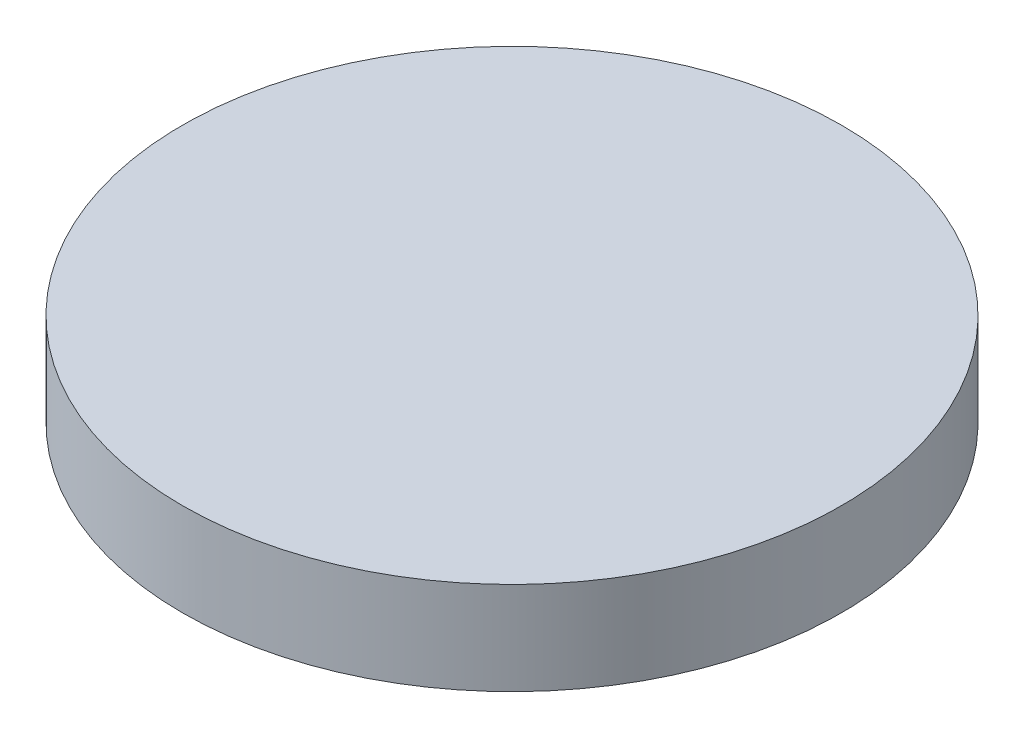
ISO-10303-21;
HEADER;
FILE_DESCRIPTION(('STEP AP214'),'2;1');
FILE_NAME('part.step','',(''),(''),'','','');
FILE_SCHEMA(('AUTOMOTIVE_DESIGN { 1 0 10303 214 1 1 1 1 }'));
ENDSEC;
DATA;
#1=APPLICATION_CONTEXT('core data for automotive mechanical design processes');
#2=APPLICATION_PROTOCOL_DEFINITION('international standard','automotive_design',2000,#1);
#3=PRODUCT_CONTEXT('',#1,'mechanical');
#4=PRODUCT('Part','Part','',(#3));
#5=PRODUCT_RELATED_PRODUCT_CATEGORY('part','',(#4));
#6=PRODUCT_DEFINITION_FORMATION('','',#4);
#7=PRODUCT_DEFINITION_CONTEXT('part definition',#1,'design');
#8=PRODUCT_DEFINITION('design','',#6,#7);
#9=PRODUCT_DEFINITION_SHAPE('','',#8);
#10=(LENGTH_UNIT() NAMED_UNIT(*) SI_UNIT(.MILLI.,.METRE.));
#11=(NAMED_UNIT(*) PLANE_ANGLE_UNIT() SI_UNIT($,.RADIAN.));
#12=(NAMED_UNIT(*) SI_UNIT($,.STERADIAN.) SOLID_ANGLE_UNIT());
#13=UNCERTAINTY_MEASURE_WITH_UNIT(LENGTH_MEASURE(1.E-05),#10,'distance_accuracy_value','');
#14=(GEOMETRIC_REPRESENTATION_CONTEXT(3) GLOBAL_UNCERTAINTY_ASSIGNED_CONTEXT((#13)) GLOBAL_UNIT_ASSIGNED_CONTEXT((#10,
#11,#12)) REPRESENTATION_CONTEXT('',''));
#15=CARTESIAN_POINT('',(0.,0.,0.));
#16=DIRECTION('',(0.,0.,1.));
#17=DIRECTION('',(1.,0.,0.));
#18=AXIS2_PLACEMENT_3D('',#15,#16,#17);
#19=CARTESIAN_POINT('',(0.,-1.,0.));
#20=DIRECTION('',(0.,1.,0.));
#21=DIRECTION('',(0.,0.,1.));
#22=AXIS2_PLACEMENT_3D('',#19,#20,#21);
#23=CYLINDRICAL_SURFACE('',#22,3.55);
#24=CARTESIAN_POINT('',(0.,-1.,0.));
#25=DIRECTION('',(0.,1.,0.));
#26=DIRECTION('',(0.,0.,1.));
#27=AXIS2_PLACEMENT_3D('',#24,#25,#26);
#28=CIRCLE('',#27,3.55);
#29=CARTESIAN_POINT('',(0.,-1.,3.55));
#30=VERTEX_POINT('',#29);
#31=EDGE_CURVE('E10',#30,#30,#28,.T.);
#32=ORIENTED_EDGE('',*,*,#31,.T.);
#33=EDGE_LOOP('',(#32));
#34=FACE_BOUND('',#33,.T.);
#35=CARTESIAN_POINT('',(0.,0.,0.));
#36=DIRECTION('',(0.,1.,0.));
#37=DIRECTION('',(0.,0.,1.));
#38=AXIS2_PLACEMENT_3D('',#35,#36,#37);
#39=CIRCLE('',#38,3.55);
#40=CARTESIAN_POINT('',(0.,0.,3.55));
#41=VERTEX_POINT('',#40);
#42=EDGE_CURVE('E21',#41,#41,#39,.T.);
#43=ORIENTED_EDGE('',*,*,#42,.F.);
#44=EDGE_LOOP('',(#43));
#45=FACE_BOUND('',#44,.T.);
#46=ADVANCED_FACE('F14',(#34,#45),#23,.T.);
#47=CARTESIAN_POINT('',(0.,-1.,0.));
#48=DIRECTION('',(0.,1.,0.));
#49=DIRECTION('',(0.,0.,1.));
#50=AXIS2_PLACEMENT_3D('',#47,#48,#49);
#51=PLANE('',#50);
#52=ORIENTED_EDGE('',*,*,#31,.F.);
#53=EDGE_LOOP('',(#52));
#54=FACE_BOUND('',#53,.T.);
#55=ADVANCED_FACE('F32',(#54),#51,.F.);
#56=CARTESIAN_POINT('',(0.,0.,0.));
#57=DIRECTION('',(0.,1.,0.));
#58=DIRECTION('',(0.,0.,1.));
#59=AXIS2_PLACEMENT_3D('',#56,#57,#58);
#60=PLANE('',#59);
#61=ORIENTED_EDGE('',*,*,#42,.T.);
#62=EDGE_LOOP('',(#61));
#63=FACE_BOUND('',#62,.T.);
#64=ADVANCED_FACE('F29',(#63),#60,.T.);
#65=CLOSED_SHELL('',(#46,#55,#64));
#66=MANIFOLD_SOLID_BREP('B1',#65);
#67=ADVANCED_BREP_SHAPE_REPRESENTATION('',(#18,#66),#14);
#68=SHAPE_DEFINITION_REPRESENTATION(#9,#67);
ENDSEC;
END-ISO-10303-21;
